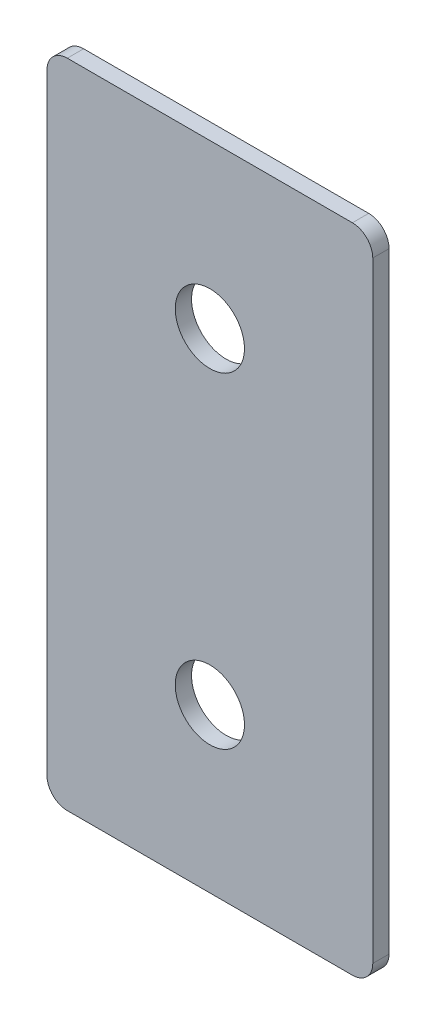
ISO-10303-21;
HEADER;
FILE_DESCRIPTION(('STEP AP214'),'2;1');
FILE_NAME('part.step','',(''),(''),'','','');
FILE_SCHEMA(('AUTOMOTIVE_DESIGN { 1 0 10303 214 1 1 1 1 }'));
ENDSEC;
DATA;
#1=APPLICATION_CONTEXT('core data for automotive mechanical design processes');
#2=APPLICATION_PROTOCOL_DEFINITION('international standard','automotive_design',2000,#1);
#3=PRODUCT_CONTEXT('',#1,'mechanical');
#4=PRODUCT('Part','Part','',(#3));
#5=PRODUCT_RELATED_PRODUCT_CATEGORY('part','',(#4));
#6=PRODUCT_DEFINITION_FORMATION('','',#4);
#7=PRODUCT_DEFINITION_CONTEXT('part definition',#1,'design');
#8=PRODUCT_DEFINITION('design','',#6,#7);
#9=PRODUCT_DEFINITION_SHAPE('','',#8);
#10=(LENGTH_UNIT() NAMED_UNIT(*) SI_UNIT(.MILLI.,.METRE.));
#11=(NAMED_UNIT(*) PLANE_ANGLE_UNIT() SI_UNIT($,.RADIAN.));
#12=(NAMED_UNIT(*) SI_UNIT($,.STERADIAN.) SOLID_ANGLE_UNIT());
#13=UNCERTAINTY_MEASURE_WITH_UNIT(LENGTH_MEASURE(1.E-05),#10,'distance_accuracy_value','');
#14=(GEOMETRIC_REPRESENTATION_CONTEXT(3) GLOBAL_UNCERTAINTY_ASSIGNED_CONTEXT((#13)) GLOBAL_UNIT_ASSIGNED_CONTEXT((#10,
#11,#12)) REPRESENTATION_CONTEXT('',''));
#15=CARTESIAN_POINT('',(0.,0.,0.));
#16=DIRECTION('',(0.,0.,1.));
#17=DIRECTION('',(1.,0.,0.));
#18=AXIS2_PLACEMENT_3D('',#15,#16,#17);
#19=CARTESIAN_POINT('',(-20.,-40.,2.));
#20=DIRECTION('',(1.,0.,0.));
#21=DIRECTION('',(0.,0.,-1.));
#22=AXIS2_PLACEMENT_3D('',#19,#20,#21);
#23=PLANE('',#22);
#24=DIRECTION('',(0.,-1.,0.));
#25=VECTOR('',#24,1.);
#26=CARTESIAN_POINT('',(-20.,-40.,0.));
#27=LINE('',#26,#25);
#28=CARTESIAN_POINT('',(-20.,37.5,0.));
#29=VERTEX_POINT('',#28);
#30=CARTESIAN_POINT('',(-20.,-37.5,0.));
#31=VERTEX_POINT('',#30);
#32=EDGE_CURVE('E129',#29,#31,#27,.T.);
#33=ORIENTED_EDGE('',*,*,#32,.T.);
#34=DIRECTION('',(0.,0.,-1.));
#35=VECTOR('',#34,1.);
#36=CARTESIAN_POINT('',(-20.,-37.5,2.));
#37=LINE('',#36,#35);
#38=CARTESIAN_POINT('',(-20.,-37.5,2.));
#39=VERTEX_POINT('',#38);
#40=EDGE_CURVE('E152',#31,#39,#37,.F.);
#41=ORIENTED_EDGE('',*,*,#40,.T.);
#42=DIRECTION('',(0.,-1.,0.));
#43=VECTOR('',#42,1.);
#44=CARTESIAN_POINT('',(-20.,-40.,2.));
#45=LINE('',#44,#43);
#46=CARTESIAN_POINT('',(-20.,37.5,2.));
#47=VERTEX_POINT('',#46);
#48=EDGE_CURVE('E127',#47,#39,#45,.T.);
#49=ORIENTED_EDGE('',*,*,#48,.F.);
#50=DIRECTION('',(0.,0.,-1.));
#51=VECTOR('',#50,1.);
#52=CARTESIAN_POINT('',(-20.,37.5,2.));
#53=LINE('',#52,#51);
#54=EDGE_CURVE('E149',#47,#29,#53,.T.);
#55=ORIENTED_EDGE('',*,*,#54,.T.);
#56=EDGE_LOOP('',(#33,#41,#49,#55));
#57=FACE_BOUND('',#56,.T.);
#58=ADVANCED_FACE('F34',(#57),#23,.F.);
#59=CARTESIAN_POINT('',(20.,-40.,2.));
#60=DIRECTION('',(0.,1.,0.));
#61=DIRECTION('',(0.,0.,1.));
#62=AXIS2_PLACEMENT_3D('',#59,#60,#61);
#63=PLANE('',#62);
#64=DIRECTION('',(1.,0.,0.));
#65=VECTOR('',#64,1.);
#66=CARTESIAN_POINT('',(20.,-40.,0.));
#67=LINE('',#66,#65);
#68=CARTESIAN_POINT('',(-17.5,-40.,0.));
#69=VERTEX_POINT('',#68);
#70=CARTESIAN_POINT('',(17.5,-40.,0.));
#71=VERTEX_POINT('',#70);
#72=EDGE_CURVE('E125',#69,#71,#67,.T.);
#73=ORIENTED_EDGE('',*,*,#72,.T.);
#74=DIRECTION('',(0.,0.,-1.));
#75=VECTOR('',#74,1.);
#76=CARTESIAN_POINT('',(17.5,-40.,2.));
#77=LINE('',#76,#75);
#78=CARTESIAN_POINT('',(17.5,-40.,2.));
#79=VERTEX_POINT('',#78);
#80=EDGE_CURVE('E104',#71,#79,#77,.F.);
#81=ORIENTED_EDGE('',*,*,#80,.T.);
#82=DIRECTION('',(1.,0.,0.));
#83=VECTOR('',#82,1.);
#84=CARTESIAN_POINT('',(20.,-40.,2.));
#85=LINE('',#84,#83);
#86=CARTESIAN_POINT('',(-17.5,-40.,2.));
#87=VERTEX_POINT('',#86);
#88=EDGE_CURVE('E168',#87,#79,#85,.T.);
#89=ORIENTED_EDGE('',*,*,#88,.F.);
#90=DIRECTION('',(0.,0.,-1.));
#91=VECTOR('',#90,1.);
#92=CARTESIAN_POINT('',(-17.5,-40.,2.));
#93=LINE('',#92,#91);
#94=EDGE_CURVE('E109',#87,#69,#93,.T.);
#95=ORIENTED_EDGE('',*,*,#94,.T.);
#96=EDGE_LOOP('',(#73,#81,#89,#95));
#97=FACE_BOUND('',#96,.T.);
#98=ADVANCED_FACE('F201',(#97),#63,.F.);
#99=CARTESIAN_POINT('',(20.,-40.,2.));
#100=DIRECTION('',(-1.,0.,0.));
#101=DIRECTION('',(0.,0.,1.));
#102=AXIS2_PLACEMENT_3D('',#99,#100,#101);
#103=PLANE('',#102);
#104=DIRECTION('',(0.,1.,0.));
#105=VECTOR('',#104,1.);
#106=CARTESIAN_POINT('',(20.,-40.,2.));
#107=LINE('',#106,#105);
#108=CARTESIAN_POINT('',(20.,-37.5,2.));
#109=VERTEX_POINT('',#108);
#110=CARTESIAN_POINT('',(20.,37.5,2.));
#111=VERTEX_POINT('',#110);
#112=EDGE_CURVE('E118',#109,#111,#107,.T.);
#113=ORIENTED_EDGE('',*,*,#112,.F.);
#114=DIRECTION('',(0.,0.,-1.));
#115=VECTOR('',#114,1.);
#116=CARTESIAN_POINT('',(20.,-37.5,2.));
#117=LINE('',#116,#115);
#118=CARTESIAN_POINT('',(20.,-37.5,0.));
#119=VERTEX_POINT('',#118);
#120=EDGE_CURVE('E103',#109,#119,#117,.T.);
#121=ORIENTED_EDGE('',*,*,#120,.T.);
#122=DIRECTION('',(0.,1.,0.));
#123=VECTOR('',#122,1.);
#124=CARTESIAN_POINT('',(20.,-40.,0.));
#125=LINE('',#124,#123);
#126=CARTESIAN_POINT('',(20.,37.5,0.));
#127=VERTEX_POINT('',#126);
#128=EDGE_CURVE('E116',#119,#127,#125,.T.);
#129=ORIENTED_EDGE('',*,*,#128,.T.);
#130=DIRECTION('',(0.,0.,-1.));
#131=VECTOR('',#130,1.);
#132=CARTESIAN_POINT('',(20.,37.5,2.));
#133=LINE('',#132,#131);
#134=EDGE_CURVE('E120',#127,#111,#133,.F.);
#135=ORIENTED_EDGE('',*,*,#134,.T.);
#136=EDGE_LOOP('',(#113,#121,#129,#135));
#137=FACE_BOUND('',#136,.T.);
#138=ADVANCED_FACE('F115',(#137),#103,.F.);
#139=CARTESIAN_POINT('',(20.,40.,2.));
#140=DIRECTION('',(0.,-1.,0.));
#141=DIRECTION('',(1.,0.,0.));
#142=AXIS2_PLACEMENT_3D('',#139,#140,#141);
#143=PLANE('',#142);
#144=DIRECTION('',(-1.,0.,0.));
#145=VECTOR('',#144,1.);
#146=CARTESIAN_POINT('',(20.,40.,0.));
#147=LINE('',#146,#145);
#148=CARTESIAN_POINT('',(17.5,40.,0.));
#149=VERTEX_POINT('',#148);
#150=CARTESIAN_POINT('',(-17.5,40.,0.));
#151=VERTEX_POINT('',#150);
#152=EDGE_CURVE('E124',#149,#151,#147,.T.);
#153=ORIENTED_EDGE('',*,*,#152,.T.);
#154=DIRECTION('',(0.,0.,-1.));
#155=VECTOR('',#154,1.);
#156=CARTESIAN_POINT('',(-17.5,40.,2.));
#157=LINE('',#156,#155);
#158=CARTESIAN_POINT('',(-17.5,40.,2.));
#159=VERTEX_POINT('',#158);
#160=EDGE_CURVE('E11',#151,#159,#157,.F.);
#161=ORIENTED_EDGE('',*,*,#160,.T.);
#162=DIRECTION('',(-1.,0.,0.));
#163=VECTOR('',#162,1.);
#164=CARTESIAN_POINT('',(20.,40.,2.));
#165=LINE('',#164,#163);
#166=CARTESIAN_POINT('',(17.5,40.,2.));
#167=VERTEX_POINT('',#166);
#168=EDGE_CURVE('E133',#167,#159,#165,.T.);
#169=ORIENTED_EDGE('',*,*,#168,.F.);
#170=DIRECTION('',(0.,0.,-1.));
#171=VECTOR('',#170,1.);
#172=CARTESIAN_POINT('',(17.5,40.,2.));
#173=LINE('',#172,#171);
#174=EDGE_CURVE('E42',#167,#149,#173,.T.);
#175=ORIENTED_EDGE('',*,*,#174,.T.);
#176=EDGE_LOOP('',(#153,#161,#169,#175));
#177=FACE_BOUND('',#176,.T.);
#178=ADVANCED_FACE('F155',(#177),#143,.F.);
#179=CARTESIAN_POINT('',(0.,0.,2.));
#180=DIRECTION('',(0.,0.,1.));
#181=DIRECTION('',(1.,0.,0.));
#182=AXIS2_PLACEMENT_3D('',#179,#180,#181);
#183=PLANE('',#182);
#184=CARTESIAN_POINT('',(0.,20.,2.));
#185=DIRECTION('',(0.,0.,1.));
#186=DIRECTION('',(1.,0.,0.));
#187=AXIS2_PLACEMENT_3D('',#184,#185,#186);
#188=CIRCLE('',#187,4.25);
#189=CARTESIAN_POINT('',(4.25,20.,2.));
#190=VERTEX_POINT('',#189);
#191=EDGE_CURVE('E179',#190,#190,#188,.T.);
#192=ORIENTED_EDGE('',*,*,#191,.F.);
#193=EDGE_LOOP('',(#192));
#194=FACE_BOUND('',#193,.T.);
#195=CARTESIAN_POINT('',(0.,-20.,2.));
#196=DIRECTION('',(0.,0.,1.));
#197=DIRECTION('',(1.,0.,0.));
#198=AXIS2_PLACEMENT_3D('',#195,#196,#197);
#199=CIRCLE('',#198,4.25);
#200=CARTESIAN_POINT('',(4.25,-20.,2.));
#201=VERTEX_POINT('',#200);
#202=EDGE_CURVE('E173',#201,#201,#199,.T.);
#203=ORIENTED_EDGE('',*,*,#202,.F.);
#204=EDGE_LOOP('',(#203));
#205=FACE_BOUND('',#204,.T.);
#206=ORIENTED_EDGE('',*,*,#88,.T.);
#207=CARTESIAN_POINT('',(17.5,-37.5,2.));
#208=DIRECTION('',(0.,0.,1.));
#209=DIRECTION('',(1.,0.,0.));
#210=AXIS2_PLACEMENT_3D('',#207,#208,#209);
#211=CIRCLE('',#210,2.5);
#212=EDGE_CURVE('E147',#79,#109,#211,.T.);
#213=ORIENTED_EDGE('',*,*,#212,.T.);
#214=ORIENTED_EDGE('',*,*,#112,.T.);
#215=CARTESIAN_POINT('',(17.5,37.5,2.));
#216=DIRECTION('',(0.,0.,1.));
#217=DIRECTION('',(1.,0.,0.));
#218=AXIS2_PLACEMENT_3D('',#215,#216,#217);
#219=CIRCLE('',#218,2.5);
#220=EDGE_CURVE('E54',#111,#167,#219,.T.);
#221=ORIENTED_EDGE('',*,*,#220,.T.);
#222=ORIENTED_EDGE('',*,*,#168,.T.);
#223=CARTESIAN_POINT('',(-17.5,37.5,2.));
#224=DIRECTION('',(0.,0.,1.));
#225=DIRECTION('',(1.,0.,0.));
#226=AXIS2_PLACEMENT_3D('',#223,#224,#225);
#227=CIRCLE('',#226,2.5);
#228=EDGE_CURVE('E143',#159,#47,#227,.T.);
#229=ORIENTED_EDGE('',*,*,#228,.T.);
#230=ORIENTED_EDGE('',*,*,#48,.T.);
#231=CARTESIAN_POINT('',(-17.5,-37.5,2.));
#232=DIRECTION('',(0.,0.,1.));
#233=DIRECTION('',(1.,0.,0.));
#234=AXIS2_PLACEMENT_3D('',#231,#232,#233);
#235=CIRCLE('',#234,2.5);
#236=EDGE_CURVE('E145',#39,#87,#235,.T.);
#237=ORIENTED_EDGE('',*,*,#236,.T.);
#238=EDGE_LOOP('',(#206,#213,#214,#221,#222,#229,#230,#237));
#239=FACE_BOUND('',#238,.T.);
#240=ADVANCED_FACE('F194',(#194,#205,#239),#183,.T.);
#241=CARTESIAN_POINT('',(0.,0.,0.));
#242=DIRECTION('',(0.,0.,1.));
#243=DIRECTION('',(1.,0.,0.));
#244=AXIS2_PLACEMENT_3D('',#241,#242,#243);
#245=PLANE('',#244);
#246=CARTESIAN_POINT('',(0.,20.,0.));
#247=DIRECTION('',(0.,0.,1.));
#248=DIRECTION('',(1.,0.,0.));
#249=AXIS2_PLACEMENT_3D('',#246,#247,#248);
#250=CIRCLE('',#249,4.25);
#251=CARTESIAN_POINT('',(4.25,20.,0.));
#252=VERTEX_POINT('',#251);
#253=EDGE_CURVE('E177',#252,#252,#250,.T.);
#254=ORIENTED_EDGE('',*,*,#253,.T.);
#255=EDGE_LOOP('',(#254));
#256=FACE_BOUND('',#255,.T.);
#257=CARTESIAN_POINT('',(0.,-20.,0.));
#258=DIRECTION('',(0.,0.,1.));
#259=DIRECTION('',(1.,0.,0.));
#260=AXIS2_PLACEMENT_3D('',#257,#258,#259);
#261=CIRCLE('',#260,4.25);
#262=CARTESIAN_POINT('',(4.25,-20.,0.));
#263=VERTEX_POINT('',#262);
#264=EDGE_CURVE('E184',#263,#263,#261,.T.);
#265=ORIENTED_EDGE('',*,*,#264,.T.);
#266=EDGE_LOOP('',(#265));
#267=FACE_BOUND('',#266,.T.);
#268=ORIENTED_EDGE('',*,*,#128,.F.);
#269=CARTESIAN_POINT('',(17.5,-37.5,0.));
#270=DIRECTION('',(0.,0.,1.));
#271=DIRECTION('',(1.,0.,0.));
#272=AXIS2_PLACEMENT_3D('',#269,#270,#271);
#273=CIRCLE('',#272,2.5);
#274=EDGE_CURVE('E99',#119,#71,#273,.F.);
#275=ORIENTED_EDGE('',*,*,#274,.T.);
#276=ORIENTED_EDGE('',*,*,#72,.F.);
#277=CARTESIAN_POINT('',(-17.5,-37.5,0.));
#278=DIRECTION('',(0.,0.,1.));
#279=DIRECTION('',(1.,0.,0.));
#280=AXIS2_PLACEMENT_3D('',#277,#278,#279);
#281=CIRCLE('',#280,2.5);
#282=EDGE_CURVE('E110',#69,#31,#281,.F.);
#283=ORIENTED_EDGE('',*,*,#282,.T.);
#284=ORIENTED_EDGE('',*,*,#32,.F.);
#285=CARTESIAN_POINT('',(-17.5,37.5,0.));
#286=DIRECTION('',(0.,0.,1.));
#287=DIRECTION('',(1.,0.,0.));
#288=AXIS2_PLACEMENT_3D('',#285,#286,#287);
#289=CIRCLE('',#288,2.5);
#290=EDGE_CURVE('E136',#29,#151,#289,.F.);
#291=ORIENTED_EDGE('',*,*,#290,.T.);
#292=ORIENTED_EDGE('',*,*,#152,.F.);
#293=CARTESIAN_POINT('',(17.5,37.5,0.));
#294=DIRECTION('',(0.,0.,1.));
#295=DIRECTION('',(1.,0.,0.));
#296=AXIS2_PLACEMENT_3D('',#293,#294,#295);
#297=CIRCLE('',#296,2.5);
#298=EDGE_CURVE('E119',#149,#127,#297,.F.);
#299=ORIENTED_EDGE('',*,*,#298,.T.);
#300=EDGE_LOOP('',(#268,#275,#276,#283,#284,#291,#292,#299));
#301=FACE_BOUND('',#300,.T.);
#302=ADVANCED_FACE('F122',(#256,#267,#301),#245,.F.);
#303=CARTESIAN_POINT('',(0.,-20.,0.));
#304=DIRECTION('',(0.,0.,1.));
#305=DIRECTION('',(1.,0.,0.));
#306=AXIS2_PLACEMENT_3D('',#303,#304,#305);
#307=CYLINDRICAL_SURFACE('',#306,4.25);
#308=ORIENTED_EDGE('',*,*,#264,.F.);
#309=EDGE_LOOP('',(#308));
#310=FACE_BOUND('',#309,.T.);
#311=ORIENTED_EDGE('',*,*,#202,.T.);
#312=EDGE_LOOP('',(#311));
#313=FACE_BOUND('',#312,.T.);
#314=ADVANCED_FACE('F192',(#310,#313),#307,.F.);
#315=CARTESIAN_POINT('',(0.,20.,0.));
#316=DIRECTION('',(0.,0.,1.));
#317=DIRECTION('',(1.,0.,0.));
#318=AXIS2_PLACEMENT_3D('',#315,#316,#317);
#319=CYLINDRICAL_SURFACE('',#318,4.25);
#320=ORIENTED_EDGE('',*,*,#253,.F.);
#321=EDGE_LOOP('',(#320));
#322=FACE_BOUND('',#321,.T.);
#323=ORIENTED_EDGE('',*,*,#191,.T.);
#324=EDGE_LOOP('',(#323));
#325=FACE_BOUND('',#324,.T.);
#326=ADVANCED_FACE('F210',(#322,#325),#319,.F.);
#327=CARTESIAN_POINT('',(17.5,-37.5,2.));
#328=DIRECTION('',(0.,0.,-1.));
#329=DIRECTION('',(-1.,0.,0.));
#330=AXIS2_PLACEMENT_3D('',#327,#328,#329);
#331=CYLINDRICAL_SURFACE('',#330,2.5);
#332=ORIENTED_EDGE('',*,*,#212,.F.);
#333=ORIENTED_EDGE('',*,*,#80,.F.);
#334=ORIENTED_EDGE('',*,*,#274,.F.);
#335=ORIENTED_EDGE('',*,*,#120,.F.);
#336=EDGE_LOOP('',(#332,#333,#334,#335));
#337=FACE_BOUND('',#336,.T.);
#338=ADVANCED_FACE('F102',(#337),#331,.T.);
#339=CARTESIAN_POINT('',(-17.5,-37.5,2.));
#340=DIRECTION('',(0.,0.,-1.));
#341=DIRECTION('',(-1.,0.,0.));
#342=AXIS2_PLACEMENT_3D('',#339,#340,#341);
#343=CYLINDRICAL_SURFACE('',#342,2.5);
#344=ORIENTED_EDGE('',*,*,#236,.F.);
#345=ORIENTED_EDGE('',*,*,#40,.F.);
#346=ORIENTED_EDGE('',*,*,#282,.F.);
#347=ORIENTED_EDGE('',*,*,#94,.F.);
#348=EDGE_LOOP('',(#344,#345,#346,#347));
#349=FACE_BOUND('',#348,.T.);
#350=ADVANCED_FACE('F203',(#349),#343,.T.);
#351=CARTESIAN_POINT('',(-17.5,37.5,2.));
#352=DIRECTION('',(0.,0.,-1.));
#353=DIRECTION('',(-1.,0.,0.));
#354=AXIS2_PLACEMENT_3D('',#351,#352,#353);
#355=CYLINDRICAL_SURFACE('',#354,2.5);
#356=ORIENTED_EDGE('',*,*,#228,.F.);
#357=ORIENTED_EDGE('',*,*,#160,.F.);
#358=ORIENTED_EDGE('',*,*,#290,.F.);
#359=ORIENTED_EDGE('',*,*,#54,.F.);
#360=EDGE_LOOP('',(#356,#357,#358,#359));
#361=FACE_BOUND('',#360,.T.);
#362=ADVANCED_FACE('F162',(#361),#355,.T.);
#363=CARTESIAN_POINT('',(17.5,37.5,2.));
#364=DIRECTION('',(0.,0.,-1.));
#365=DIRECTION('',(-1.,0.,0.));
#366=AXIS2_PLACEMENT_3D('',#363,#364,#365);
#367=CYLINDRICAL_SURFACE('',#366,2.5);
#368=ORIENTED_EDGE('',*,*,#220,.F.);
#369=ORIENTED_EDGE('',*,*,#134,.F.);
#370=ORIENTED_EDGE('',*,*,#298,.F.);
#371=ORIENTED_EDGE('',*,*,#174,.F.);
#372=EDGE_LOOP('',(#368,#369,#370,#371));
#373=FACE_BOUND('',#372,.T.);
#374=ADVANCED_FACE('F36',(#373),#367,.T.);
#375=CLOSED_SHELL('',(#58,#98,#138,#178,#240,#302,#314,#326,#338,#350,#362,#374));
#376=MANIFOLD_SOLID_BREP('B2',#375);
#377=ADVANCED_BREP_SHAPE_REPRESENTATION('',(#18,#376),#14);
#378=SHAPE_DEFINITION_REPRESENTATION(#9,#377);
ENDSEC;
END-ISO-10303-21;
